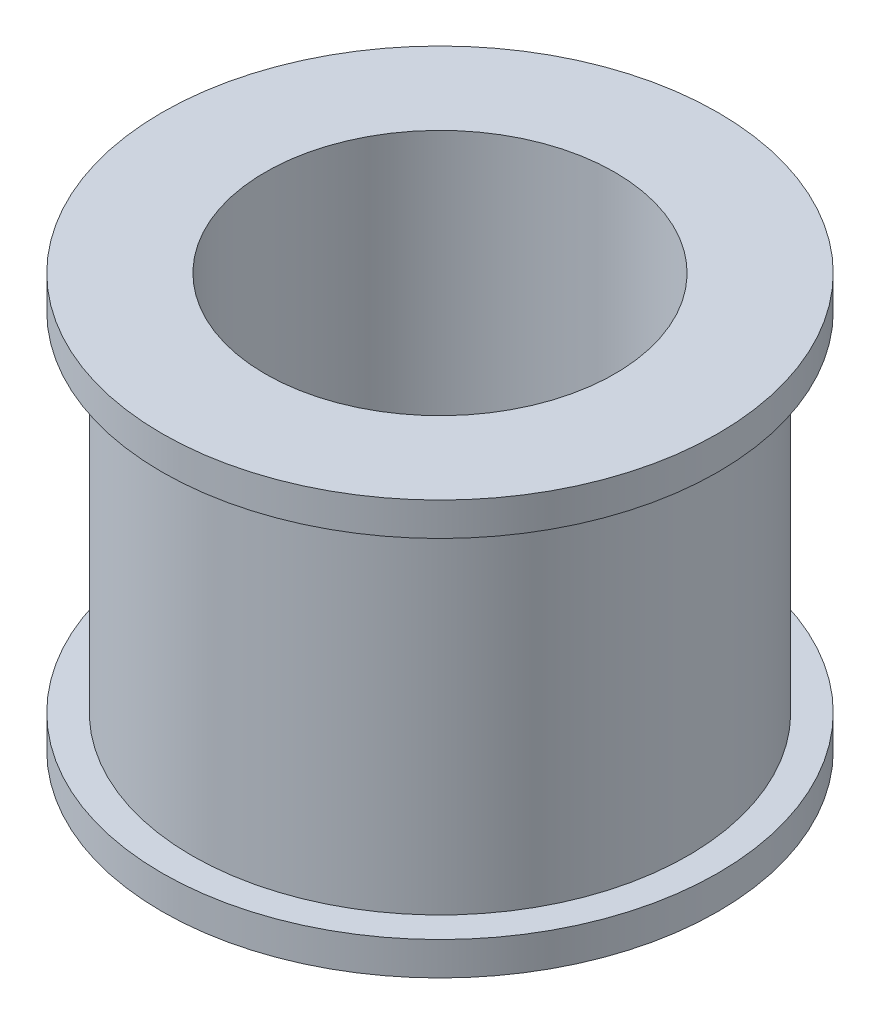
ISO-10303-21;
HEADER;
FILE_DESCRIPTION(('STEP AP214'),'2;1');
FILE_NAME('part.step','',(''),(''),'','','');
FILE_SCHEMA(('AUTOMOTIVE_DESIGN { 1 0 10303 214 1 1 1 1 }'));
ENDSEC;
DATA;
#1=APPLICATION_CONTEXT('core data for automotive mechanical design processes');
#2=APPLICATION_PROTOCOL_DEFINITION('international standard','automotive_design',2000,#1);
#3=PRODUCT_CONTEXT('',#1,'mechanical');
#4=PRODUCT('Part','Part','',(#3));
#5=PRODUCT_RELATED_PRODUCT_CATEGORY('part','',(#4));
#6=PRODUCT_DEFINITION_FORMATION('','',#4);
#7=PRODUCT_DEFINITION_CONTEXT('part definition',#1,'design');
#8=PRODUCT_DEFINITION('design','',#6,#7);
#9=PRODUCT_DEFINITION_SHAPE('','',#8);
#10=(LENGTH_UNIT() NAMED_UNIT(*) SI_UNIT(.MILLI.,.METRE.));
#11=(NAMED_UNIT(*) PLANE_ANGLE_UNIT() SI_UNIT($,.RADIAN.));
#12=(NAMED_UNIT(*) SI_UNIT($,.STERADIAN.) SOLID_ANGLE_UNIT());
#13=UNCERTAINTY_MEASURE_WITH_UNIT(LENGTH_MEASURE(1.E-05),#10,'distance_accuracy_value','');
#14=(GEOMETRIC_REPRESENTATION_CONTEXT(3) GLOBAL_UNCERTAINTY_ASSIGNED_CONTEXT((#13)) GLOBAL_UNIT_ASSIGNED_CONTEXT((#10,
#11,#12)) REPRESENTATION_CONTEXT('',''));
#15=CARTESIAN_POINT('',(0.,0.,0.));
#16=DIRECTION('',(0.,0.,1.));
#17=DIRECTION('',(1.,0.,0.));
#18=AXIS2_PLACEMENT_3D('',#15,#16,#17);
#19=CARTESIAN_POINT('',(0.,18.6790601604261,0.));
#20=DIRECTION('',(0.,1.,0.));
#21=DIRECTION('',(0.,0.,1.));
#22=AXIS2_PLACEMENT_3D('',#19,#20,#21);
#23=CYLINDRICAL_SURFACE('',#22,8.);
#24=CARTESIAN_POINT('',(0.,18.9484,0.));
#25=DIRECTION('',(0.,1.,0.));
#26=DIRECTION('',(0.,0.,1.));
#27=AXIS2_PLACEMENT_3D('',#24,#25,#26);
#28=CIRCLE('',#27,8.);
#29=CARTESIAN_POINT('',(0.,18.9484,8.));
#30=VERTEX_POINT('',#29);
#31=EDGE_CURVE('E46',#30,#30,#28,.F.);
#32=ORIENTED_EDGE('',*,*,#31,.F.);
#33=EDGE_LOOP('',(#32));
#34=FACE_BOUND('',#33,.T.);
#35=CARTESIAN_POINT('',(0.,0.,0.));
#36=DIRECTION('',(0.,1.,0.));
#37=DIRECTION('',(0.,0.,1.));
#38=AXIS2_PLACEMENT_3D('',#35,#36,#37);
#39=CIRCLE('',#38,8.);
#40=CARTESIAN_POINT('',(0.,0.,8.));
#41=VERTEX_POINT('',#40);
#42=EDGE_CURVE('E17',#41,#41,#39,.T.);
#43=ORIENTED_EDGE('',*,*,#42,.F.);
#44=EDGE_LOOP('',(#43));
#45=FACE_BOUND('',#44,.T.);
#46=ADVANCED_FACE('F14',(#34,#45),#23,.F.);
#47=CARTESIAN_POINT('',(0.,0.,12.73));
#48=DIRECTION('',(0.,-1.,0.));
#49=DIRECTION('',(0.,0.,-1.));
#50=AXIS2_PLACEMENT_3D('',#47,#48,#49);
#51=PLANE('',#50);
#52=CARTESIAN_POINT('',(0.,0.,0.));
#53=DIRECTION('',(0.,1.,0.));
#54=DIRECTION('',(0.,0.,1.));
#55=AXIS2_PLACEMENT_3D('',#52,#53,#54);
#56=CIRCLE('',#55,12.73);
#57=CARTESIAN_POINT('',(0.,0.,12.73));
#58=VERTEX_POINT('',#57);
#59=EDGE_CURVE('E43',#58,#58,#56,.T.);
#60=ORIENTED_EDGE('',*,*,#59,.F.);
#61=EDGE_LOOP('',(#60));
#62=FACE_BOUND('',#61,.T.);
#63=ORIENTED_EDGE('',*,*,#42,.T.);
#64=EDGE_LOOP('',(#63));
#65=FACE_BOUND('',#64,.T.);
#66=ADVANCED_FACE('F56',(#62,#65),#51,.T.);
#67=CARTESIAN_POINT('',(0.,18.9484,8.));
#68=DIRECTION('',(0.,1.,0.));
#69=DIRECTION('',(0.,0.,1.));
#70=AXIS2_PLACEMENT_3D('',#67,#68,#69);
#71=PLANE('',#70);
#72=ORIENTED_EDGE('',*,*,#31,.T.);
#73=EDGE_LOOP('',(#72));
#74=FACE_BOUND('',#73,.T.);
#75=CARTESIAN_POINT('',(0.,18.9484,0.));
#76=DIRECTION('',(0.,1.,0.));
#77=DIRECTION('',(0.,0.,1.));
#78=AXIS2_PLACEMENT_3D('',#75,#76,#77);
#79=CIRCLE('',#78,12.73);
#80=CARTESIAN_POINT('',(0.,18.9484,12.73));
#81=VERTEX_POINT('',#80);
#82=EDGE_CURVE('E39',#81,#81,#79,.F.);
#83=ORIENTED_EDGE('',*,*,#82,.F.);
#84=EDGE_LOOP('',(#83));
#85=FACE_BOUND('',#84,.T.);
#86=ADVANCED_FACE('F63',(#74,#85),#71,.T.);
#87=CARTESIAN_POINT('',(0.,18.6790601604261,0.));
#88=DIRECTION('',(0.,1.,0.));
#89=DIRECTION('',(0.,0.,1.));
#90=AXIS2_PLACEMENT_3D('',#87,#88,#89);
#91=CYLINDRICAL_SURFACE('',#90,12.73);
#92=ORIENTED_EDGE('',*,*,#59,.T.);
#93=EDGE_LOOP('',(#92));
#94=FACE_BOUND('',#93,.T.);
#95=CARTESIAN_POINT('',(0.,1.524,0.));
#96=DIRECTION('',(0.,1.,0.));
#97=DIRECTION('',(0.,0.,1.));
#98=AXIS2_PLACEMENT_3D('',#95,#96,#97);
#99=CIRCLE('',#98,12.73);
#100=CARTESIAN_POINT('',(0.,1.524,12.73));
#101=VERTEX_POINT('',#100);
#102=EDGE_CURVE('E36',#101,#101,#99,.T.);
#103=ORIENTED_EDGE('',*,*,#102,.F.);
#104=EDGE_LOOP('',(#103));
#105=FACE_BOUND('',#104,.T.);
#106=ADVANCED_FACE('F84',(#94,#105),#91,.T.);
#107=CARTESIAN_POINT('',(0.,18.6790601604261,0.));
#108=DIRECTION('',(0.,1.,0.));
#109=DIRECTION('',(0.,0.,1.));
#110=AXIS2_PLACEMENT_3D('',#107,#108,#109);
#111=CYLINDRICAL_SURFACE('',#110,12.73);
#112=CARTESIAN_POINT('',(0.,17.4244,0.));
#113=DIRECTION('',(0.,1.,0.));
#114=DIRECTION('',(0.,0.,1.));
#115=AXIS2_PLACEMENT_3D('',#112,#113,#114);
#116=CIRCLE('',#115,12.73);
#117=CARTESIAN_POINT('',(0.,17.4244,12.73));
#118=VERTEX_POINT('',#117);
#119=EDGE_CURVE('E31',#118,#118,#116,.F.);
#120=ORIENTED_EDGE('',*,*,#119,.F.);
#121=EDGE_LOOP('',(#120));
#122=FACE_BOUND('',#121,.T.);
#123=ORIENTED_EDGE('',*,*,#82,.T.);
#124=EDGE_LOOP('',(#123));
#125=FACE_BOUND('',#124,.T.);
#126=ADVANCED_FACE('F80',(#122,#125),#111,.T.);
#127=CARTESIAN_POINT('',(0.,1.524,11.3538));
#128=DIRECTION('',(0.,1.,0.));
#129=DIRECTION('',(0.,0.,1.));
#130=AXIS2_PLACEMENT_3D('',#127,#128,#129);
#131=PLANE('',#130);
#132=CARTESIAN_POINT('',(0.,1.524,0.));
#133=DIRECTION('',(0.,1.,0.));
#134=DIRECTION('',(0.,0.,1.));
#135=AXIS2_PLACEMENT_3D('',#132,#133,#134);
#136=CIRCLE('',#135,11.3538);
#137=CARTESIAN_POINT('',(0.,1.524,11.3538));
#138=VERTEX_POINT('',#137);
#139=EDGE_CURVE('E22',#138,#138,#136,.T.);
#140=ORIENTED_EDGE('',*,*,#139,.F.);
#141=EDGE_LOOP('',(#140));
#142=FACE_BOUND('',#141,.T.);
#143=ORIENTED_EDGE('',*,*,#102,.T.);
#144=EDGE_LOOP('',(#143));
#145=FACE_BOUND('',#144,.T.);
#146=ADVANCED_FACE('F73',(#142,#145),#131,.T.);
#147=CARTESIAN_POINT('',(0.,17.4244,12.73));
#148=DIRECTION('',(0.,-1.,0.));
#149=DIRECTION('',(0.,0.,-1.));
#150=AXIS2_PLACEMENT_3D('',#147,#148,#149);
#151=PLANE('',#150);
#152=ORIENTED_EDGE('',*,*,#119,.T.);
#153=EDGE_LOOP('',(#152));
#154=FACE_BOUND('',#153,.T.);
#155=CARTESIAN_POINT('',(0.,17.4244,0.));
#156=DIRECTION('',(0.,1.,0.));
#157=DIRECTION('',(0.,0.,1.));
#158=AXIS2_PLACEMENT_3D('',#155,#156,#157);
#159=CIRCLE('',#158,11.3538);
#160=CARTESIAN_POINT('',(0.,17.4244,11.3538));
#161=VERTEX_POINT('',#160);
#162=EDGE_CURVE('E10',#161,#161,#159,.F.);
#163=ORIENTED_EDGE('',*,*,#162,.F.);
#164=EDGE_LOOP('',(#163));
#165=FACE_BOUND('',#164,.T.);
#166=ADVANCED_FACE('F67',(#154,#165),#151,.T.);
#167=CARTESIAN_POINT('',(0.,18.6790601604261,0.));
#168=DIRECTION('',(0.,1.,0.));
#169=DIRECTION('',(0.,0.,1.));
#170=AXIS2_PLACEMENT_3D('',#167,#168,#169);
#171=CYLINDRICAL_SURFACE('',#170,11.3538);
#172=ORIENTED_EDGE('',*,*,#162,.T.);
#173=EDGE_LOOP('',(#172));
#174=FACE_BOUND('',#173,.T.);
#175=ORIENTED_EDGE('',*,*,#139,.T.);
#176=EDGE_LOOP('',(#175));
#177=FACE_BOUND('',#176,.T.);
#178=ADVANCED_FACE('F65',(#174,#177),#171,.T.);
#179=CLOSED_SHELL('',(#46,#66,#86,#106,#126,#146,#166,#178));
#180=MANIFOLD_SOLID_BREP('B1',#179);
#181=ADVANCED_BREP_SHAPE_REPRESENTATION('',(#18,#180),#14);
#182=SHAPE_DEFINITION_REPRESENTATION(#9,#181);
ENDSEC;
END-ISO-10303-21;
